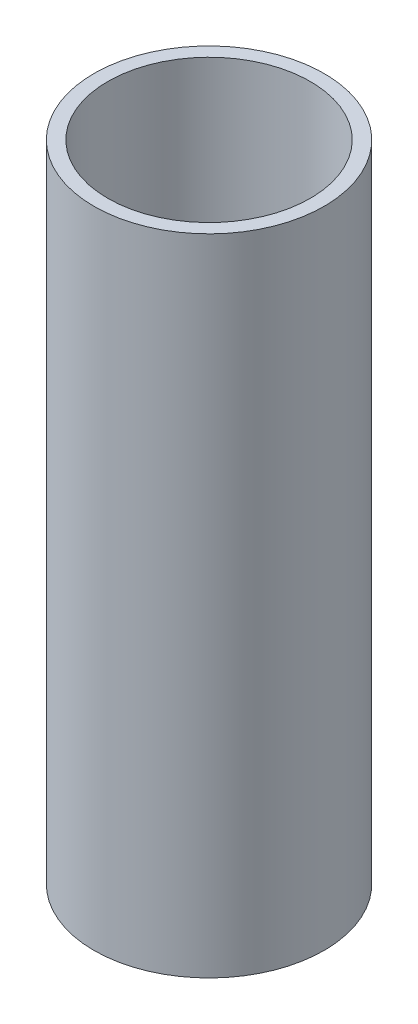
ISO-10303-21;
HEADER;
FILE_DESCRIPTION(('STEP AP214'),'2;1');
FILE_NAME('part.step','',(''),(''),'','','');
FILE_SCHEMA(('AUTOMOTIVE_DESIGN { 1 0 10303 214 1 1 1 1 }'));
ENDSEC;
DATA;
#1=APPLICATION_CONTEXT('core data for automotive mechanical design processes');
#2=APPLICATION_PROTOCOL_DEFINITION('international standard','automotive_design',2000,#1);
#3=PRODUCT_CONTEXT('',#1,'mechanical');
#4=PRODUCT('Part','Part','',(#3));
#5=PRODUCT_RELATED_PRODUCT_CATEGORY('part','',(#4));
#6=PRODUCT_DEFINITION_FORMATION('','',#4);
#7=PRODUCT_DEFINITION_CONTEXT('part definition',#1,'design');
#8=PRODUCT_DEFINITION('design','',#6,#7);
#9=PRODUCT_DEFINITION_SHAPE('','',#8);
#10=(LENGTH_UNIT() NAMED_UNIT(*) SI_UNIT(.MILLI.,.METRE.));
#11=(NAMED_UNIT(*) PLANE_ANGLE_UNIT() SI_UNIT($,.RADIAN.));
#12=(NAMED_UNIT(*) SI_UNIT($,.STERADIAN.) SOLID_ANGLE_UNIT());
#13=UNCERTAINTY_MEASURE_WITH_UNIT(LENGTH_MEASURE(1.E-05),#10,'distance_accuracy_value','');
#14=(GEOMETRIC_REPRESENTATION_CONTEXT(3) GLOBAL_UNCERTAINTY_ASSIGNED_CONTEXT((#13)) GLOBAL_UNIT_ASSIGNED_CONTEXT((#10,
#11,#12)) REPRESENTATION_CONTEXT('',''));
#15=CARTESIAN_POINT('',(0.,0.,0.));
#16=DIRECTION('',(0.,0.,1.));
#17=DIRECTION('',(1.,0.,0.));
#18=AXIS2_PLACEMENT_3D('',#15,#16,#17);
#19=CARTESIAN_POINT('',(0.,140.,0.));
#20=DIRECTION('',(0.,1.,0.));
#21=DIRECTION('',(0.,0.,1.));
#22=AXIS2_PLACEMENT_3D('',#19,#20,#21);
#23=PLANE('',#22);
#24=CARTESIAN_POINT('',(0.,140.,0.));
#25=DIRECTION('',(0.,1.,0.));
#26=DIRECTION('',(0.,0.,1.));
#27=AXIS2_PLACEMENT_3D('',#24,#25,#26);
#28=CIRCLE('',#27,25.);
#29=CARTESIAN_POINT('',(0.,140.,25.));
#30=VERTEX_POINT('',#29);
#31=EDGE_CURVE('E10',#30,#30,#28,.T.);
#32=ORIENTED_EDGE('',*,*,#31,.T.);
#33=EDGE_LOOP('',(#32));
#34=FACE_BOUND('',#33,.T.);
#35=CARTESIAN_POINT('',(0.,140.,0.));
#36=DIRECTION('',(0.,1.,0.));
#37=DIRECTION('',(0.,0.,1.));
#38=AXIS2_PLACEMENT_3D('',#35,#36,#37);
#39=CIRCLE('',#38,22.);
#40=CARTESIAN_POINT('',(0.,140.,22.));
#41=VERTEX_POINT('',#40);
#42=EDGE_CURVE('E42',#41,#41,#39,.T.);
#43=ORIENTED_EDGE('',*,*,#42,.F.);
#44=EDGE_LOOP('',(#43));
#45=FACE_BOUND('',#44,.T.);
#46=ADVANCED_FACE('F31',(#34,#45),#23,.T.);
#47=CARTESIAN_POINT('',(0.,0.,0.));
#48=DIRECTION('',(0.,1.,0.));
#49=DIRECTION('',(0.,0.,1.));
#50=AXIS2_PLACEMENT_3D('',#47,#48,#49);
#51=PLANE('',#50);
#52=CARTESIAN_POINT('',(0.,0.,0.));
#53=DIRECTION('',(0.,1.,0.));
#54=DIRECTION('',(0.,0.,1.));
#55=AXIS2_PLACEMENT_3D('',#52,#53,#54);
#56=CIRCLE('',#55,25.);
#57=CARTESIAN_POINT('',(0.,0.,25.));
#58=VERTEX_POINT('',#57);
#59=EDGE_CURVE('E35',#58,#58,#56,.T.);
#60=ORIENTED_EDGE('',*,*,#59,.F.);
#61=EDGE_LOOP('',(#60));
#62=FACE_BOUND('',#61,.T.);
#63=CARTESIAN_POINT('',(0.,0.,0.));
#64=DIRECTION('',(0.,1.,0.));
#65=DIRECTION('',(0.,0.,1.));
#66=AXIS2_PLACEMENT_3D('',#63,#64,#65);
#67=CIRCLE('',#66,22.);
#68=CARTESIAN_POINT('',(0.,0.,22.));
#69=VERTEX_POINT('',#68);
#70=EDGE_CURVE('E44',#69,#69,#67,.T.);
#71=ORIENTED_EDGE('',*,*,#70,.T.);
#72=EDGE_LOOP('',(#71));
#73=FACE_BOUND('',#72,.T.);
#74=ADVANCED_FACE('F54',(#62,#73),#51,.F.);
#75=CARTESIAN_POINT('',(0.,140.,0.));
#76=DIRECTION('',(0.,-1.,0.));
#77=DIRECTION('',(0.,0.,-1.));
#78=AXIS2_PLACEMENT_3D('',#75,#76,#77);
#79=CYLINDRICAL_SURFACE('',#78,25.);
#80=ORIENTED_EDGE('',*,*,#31,.F.);
#81=EDGE_LOOP('',(#80));
#82=FACE_BOUND('',#81,.T.);
#83=ORIENTED_EDGE('',*,*,#59,.T.);
#84=EDGE_LOOP('',(#83));
#85=FACE_BOUND('',#84,.T.);
#86=ADVANCED_FACE('F33',(#82,#85),#79,.T.);
#87=CARTESIAN_POINT('',(0.,140.,0.));
#88=DIRECTION('',(0.,-1.,0.));
#89=DIRECTION('',(0.,0.,-1.));
#90=AXIS2_PLACEMENT_3D('',#87,#88,#89);
#91=CYLINDRICAL_SURFACE('',#90,22.);
#92=ORIENTED_EDGE('',*,*,#42,.T.);
#93=EDGE_LOOP('',(#92));
#94=FACE_BOUND('',#93,.T.);
#95=ORIENTED_EDGE('',*,*,#70,.F.);
#96=EDGE_LOOP('',(#95));
#97=FACE_BOUND('',#96,.T.);
#98=ADVANCED_FACE('F50',(#94,#97),#91,.F.);
#99=CLOSED_SHELL('',(#46,#74,#86,#98));
#100=MANIFOLD_SOLID_BREP('B2',#99);
#101=ADVANCED_BREP_SHAPE_REPRESENTATION('',(#18,#100),#14);
#102=SHAPE_DEFINITION_REPRESENTATION(#9,#101);
ENDSEC;
END-ISO-10303-21;
